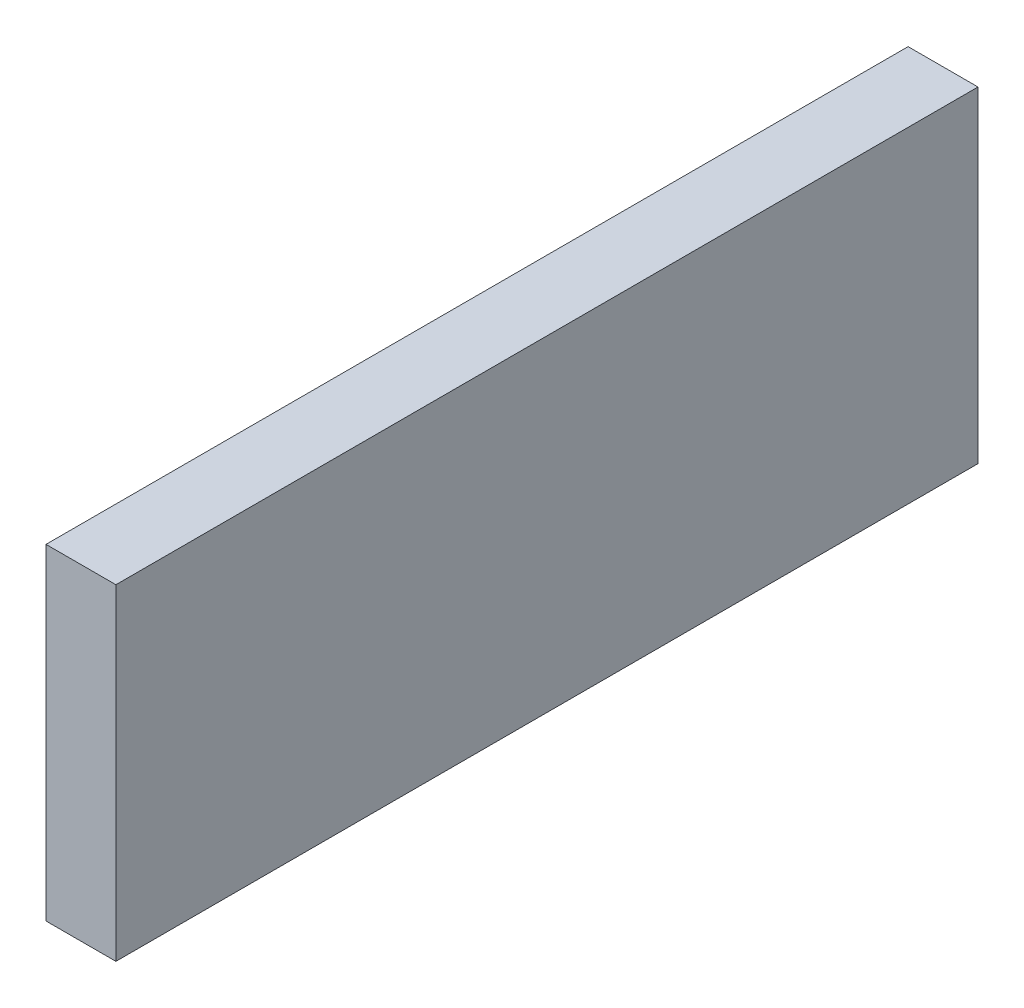
ISO-10303-21;
HEADER;
FILE_DESCRIPTION(('STEP AP214'),'2;1');
FILE_NAME('part.step','',(''),(''),'','','');
FILE_SCHEMA(('AUTOMOTIVE_DESIGN { 1 0 10303 214 1 1 1 1 }'));
ENDSEC;
DATA;
#1=APPLICATION_CONTEXT('core data for automotive mechanical design processes');
#2=APPLICATION_PROTOCOL_DEFINITION('international standard','automotive_design',2000,#1);
#3=PRODUCT_CONTEXT('',#1,'mechanical');
#4=PRODUCT('Part','Part','',(#3));
#5=PRODUCT_RELATED_PRODUCT_CATEGORY('part','',(#4));
#6=PRODUCT_DEFINITION_FORMATION('','',#4);
#7=PRODUCT_DEFINITION_CONTEXT('part definition',#1,'design');
#8=PRODUCT_DEFINITION('design','',#6,#7);
#9=PRODUCT_DEFINITION_SHAPE('','',#8);
#10=(LENGTH_UNIT() NAMED_UNIT(*) SI_UNIT(.MILLI.,.METRE.));
#11=(NAMED_UNIT(*) PLANE_ANGLE_UNIT() SI_UNIT($,.RADIAN.));
#12=(NAMED_UNIT(*) SI_UNIT($,.STERADIAN.) SOLID_ANGLE_UNIT());
#13=UNCERTAINTY_MEASURE_WITH_UNIT(LENGTH_MEASURE(1.E-05),#10,'distance_accuracy_value','');
#14=(GEOMETRIC_REPRESENTATION_CONTEXT(3) GLOBAL_UNCERTAINTY_ASSIGNED_CONTEXT((#13)) GLOBAL_UNIT_ASSIGNED_CONTEXT((#10,
#11,#12)) REPRESENTATION_CONTEXT('',''));
#15=CARTESIAN_POINT('',(0.,0.,0.));
#16=DIRECTION('',(0.,0.,1.));
#17=DIRECTION('',(1.,0.,0.));
#18=AXIS2_PLACEMENT_3D('',#15,#16,#17);
#19=CARTESIAN_POINT('',(0.,14.,0.));
#20=DIRECTION('',(1.,0.,0.));
#21=DIRECTION('',(0.,0.,-1.));
#22=AXIS2_PLACEMENT_3D('',#19,#20,#21);
#23=PLANE('',#22);
#24=DIRECTION('',(0.,0.,1.));
#25=VECTOR('',#24,1.);
#26=CARTESIAN_POINT('',(0.,0.,0.));
#27=LINE('',#26,#25);
#28=CARTESIAN_POINT('',(0.,0.,-37.));
#29=VERTEX_POINT('',#28);
#30=CARTESIAN_POINT('',(0.,0.,0.));
#31=VERTEX_POINT('',#30);
#32=EDGE_CURVE('E96',#29,#31,#27,.T.);
#33=ORIENTED_EDGE('',*,*,#32,.T.);
#34=DIRECTION('',(0.,-1.,0.));
#35=VECTOR('',#34,1.);
#36=CARTESIAN_POINT('',(0.,14.,0.));
#37=LINE('',#36,#35);
#38=CARTESIAN_POINT('',(0.,14.,0.));
#39=VERTEX_POINT('',#38);
#40=EDGE_CURVE('E11',#39,#31,#37,.T.);
#41=ORIENTED_EDGE('',*,*,#40,.F.);
#42=DIRECTION('',(0.,0.,1.));
#43=VECTOR('',#42,1.);
#44=CARTESIAN_POINT('',(0.,14.,0.));
#45=LINE('',#44,#43);
#46=CARTESIAN_POINT('',(0.,14.,-37.));
#47=VERTEX_POINT('',#46);
#48=EDGE_CURVE('E84',#47,#39,#45,.T.);
#49=ORIENTED_EDGE('',*,*,#48,.F.);
#50=DIRECTION('',(0.,-1.,0.));
#51=VECTOR('',#50,1.);
#52=CARTESIAN_POINT('',(0.,14.,-37.));
#53=LINE('',#52,#51);
#54=EDGE_CURVE('E92',#47,#29,#53,.T.);
#55=ORIENTED_EDGE('',*,*,#54,.T.);
#56=EDGE_LOOP('',(#33,#41,#49,#55));
#57=FACE_BOUND('',#56,.T.);
#58=ADVANCED_FACE('F33',(#57),#23,.F.);
#59=CARTESIAN_POINT('',(0.,14.,0.));
#60=DIRECTION('',(0.,0.,-1.));
#61=DIRECTION('',(-1.,0.,0.));
#62=AXIS2_PLACEMENT_3D('',#59,#60,#61);
#63=PLANE('',#62);
#64=DIRECTION('',(1.,0.,0.));
#65=VECTOR('',#64,1.);
#66=CARTESIAN_POINT('',(0.,0.,0.));
#67=LINE('',#66,#65);
#68=CARTESIAN_POINT('',(3.,0.,0.));
#69=VERTEX_POINT('',#68);
#70=EDGE_CURVE('E88',#31,#69,#67,.T.);
#71=ORIENTED_EDGE('',*,*,#70,.T.);
#72=DIRECTION('',(0.,-1.,0.));
#73=VECTOR('',#72,1.);
#74=CARTESIAN_POINT('',(3.,14.,0.));
#75=LINE('',#74,#73);
#76=CARTESIAN_POINT('',(3.,14.,0.));
#77=VERTEX_POINT('',#76);
#78=EDGE_CURVE('E41',#77,#69,#75,.T.);
#79=ORIENTED_EDGE('',*,*,#78,.F.);
#80=DIRECTION('',(1.,0.,0.));
#81=VECTOR('',#80,1.);
#82=CARTESIAN_POINT('',(0.,14.,0.));
#83=LINE('',#82,#81);
#84=EDGE_CURVE('E79',#39,#77,#83,.T.);
#85=ORIENTED_EDGE('',*,*,#84,.F.);
#86=ORIENTED_EDGE('',*,*,#40,.T.);
#87=EDGE_LOOP('',(#71,#79,#85,#86));
#88=FACE_BOUND('',#87,.T.);
#89=ADVANCED_FACE('F87',(#88),#63,.F.);
#90=CARTESIAN_POINT('',(3.,14.,0.));
#91=DIRECTION('',(-1.,0.,0.));
#92=DIRECTION('',(0.,0.,1.));
#93=AXIS2_PLACEMENT_3D('',#90,#91,#92);
#94=PLANE('',#93);
#95=DIRECTION('',(0.,0.,-1.));
#96=VECTOR('',#95,1.);
#97=CARTESIAN_POINT('',(3.,0.,0.));
#98=LINE('',#97,#96);
#99=CARTESIAN_POINT('',(3.,0.,-37.));
#100=VERTEX_POINT('',#99);
#101=EDGE_CURVE('E66',#69,#100,#98,.T.);
#102=ORIENTED_EDGE('',*,*,#101,.T.);
#103=DIRECTION('',(0.,-1.,0.));
#104=VECTOR('',#103,1.);
#105=CARTESIAN_POINT('',(3.,14.,-37.));
#106=LINE('',#105,#104);
#107=CARTESIAN_POINT('',(3.,14.,-37.));
#108=VERTEX_POINT('',#107);
#109=EDGE_CURVE('E89',#108,#100,#106,.T.);
#110=ORIENTED_EDGE('',*,*,#109,.F.);
#111=DIRECTION('',(0.,0.,-1.));
#112=VECTOR('',#111,1.);
#113=CARTESIAN_POINT('',(3.,14.,0.));
#114=LINE('',#113,#112);
#115=EDGE_CURVE('E82',#77,#108,#114,.T.);
#116=ORIENTED_EDGE('',*,*,#115,.F.);
#117=ORIENTED_EDGE('',*,*,#78,.T.);
#118=EDGE_LOOP('',(#102,#110,#116,#117));
#119=FACE_BOUND('',#118,.T.);
#120=ADVANCED_FACE('F90',(#119),#94,.F.);
#121=CARTESIAN_POINT('',(0.,14.,-37.));
#122=DIRECTION('',(0.,0.,1.));
#123=DIRECTION('',(1.,0.,0.));
#124=AXIS2_PLACEMENT_3D('',#121,#122,#123);
#125=PLANE('',#124);
#126=DIRECTION('',(-1.,0.,0.));
#127=VECTOR('',#126,1.);
#128=CARTESIAN_POINT('',(0.,0.,-37.));
#129=LINE('',#128,#127);
#130=EDGE_CURVE('E72',#100,#29,#129,.T.);
#131=ORIENTED_EDGE('',*,*,#130,.T.);
#132=ORIENTED_EDGE('',*,*,#54,.F.);
#133=DIRECTION('',(-1.,0.,0.));
#134=VECTOR('',#133,1.);
#135=CARTESIAN_POINT('',(0.,14.,-37.));
#136=LINE('',#135,#134);
#137=EDGE_CURVE('E49',#108,#47,#136,.T.);
#138=ORIENTED_EDGE('',*,*,#137,.F.);
#139=ORIENTED_EDGE('',*,*,#109,.T.);
#140=EDGE_LOOP('',(#131,#132,#138,#139));
#141=FACE_BOUND('',#140,.T.);
#142=ADVANCED_FACE('F103',(#141),#125,.F.);
#143=CARTESIAN_POINT('',(0.,14.,0.));
#144=DIRECTION('',(0.,-1.,0.));
#145=DIRECTION('',(0.,0.,-1.));
#146=AXIS2_PLACEMENT_3D('',#143,#144,#145);
#147=PLANE('',#146);
#148=ORIENTED_EDGE('',*,*,#48,.T.);
#149=ORIENTED_EDGE('',*,*,#84,.T.);
#150=ORIENTED_EDGE('',*,*,#115,.T.);
#151=ORIENTED_EDGE('',*,*,#137,.T.);
#152=EDGE_LOOP('',(#148,#149,#150,#151));
#153=FACE_BOUND('',#152,.T.);
#154=ADVANCED_FACE('F80',(#153),#147,.F.);
#155=CARTESIAN_POINT('',(0.,0.,0.));
#156=DIRECTION('',(0.,-1.,0.));
#157=DIRECTION('',(0.,0.,-1.));
#158=AXIS2_PLACEMENT_3D('',#155,#156,#157);
#159=PLANE('',#158);
#160=ORIENTED_EDGE('',*,*,#32,.F.);
#161=ORIENTED_EDGE('',*,*,#130,.F.);
#162=ORIENTED_EDGE('',*,*,#101,.F.);
#163=ORIENTED_EDGE('',*,*,#70,.F.);
#164=EDGE_LOOP('',(#160,#161,#162,#163));
#165=FACE_BOUND('',#164,.T.);
#166=ADVANCED_FACE('F106',(#165),#159,.T.);
#167=CLOSED_SHELL('',(#58,#89,#120,#142,#154,#166));
#168=MANIFOLD_SOLID_BREP('B2',#167);
#169=ADVANCED_BREP_SHAPE_REPRESENTATION('',(#18,#168),#14);
#170=SHAPE_DEFINITION_REPRESENTATION(#9,#169);
ENDSEC;
END-ISO-10303-21;
